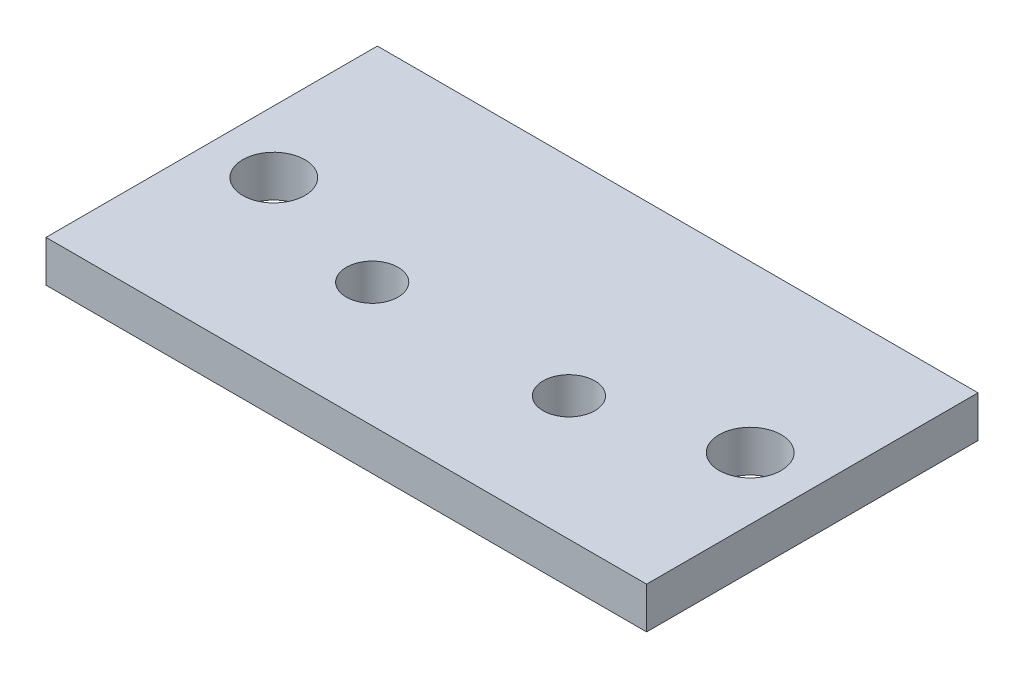
ISO-10303-21;
HEADER;
FILE_DESCRIPTION(('STEP AP214'),'2;1');
FILE_NAME('part.step','',(''),(''),'','','');
FILE_SCHEMA(('AUTOMOTIVE_DESIGN { 1 0 10303 214 1 1 1 1 }'));
ENDSEC;
DATA;
#1=APPLICATION_CONTEXT('core data for automotive mechanical design processes');
#2=APPLICATION_PROTOCOL_DEFINITION('international standard','automotive_design',2000,#1);
#3=PRODUCT_CONTEXT('',#1,'mechanical');
#4=PRODUCT('Part','Part','',(#3));
#5=PRODUCT_RELATED_PRODUCT_CATEGORY('part','',(#4));
#6=PRODUCT_DEFINITION_FORMATION('','',#4);
#7=PRODUCT_DEFINITION_CONTEXT('part definition',#1,'design');
#8=PRODUCT_DEFINITION('design','',#6,#7);
#9=PRODUCT_DEFINITION_SHAPE('','',#8);
#10=(LENGTH_UNIT() NAMED_UNIT(*) SI_UNIT(.MILLI.,.METRE.));
#11=(NAMED_UNIT(*) PLANE_ANGLE_UNIT() SI_UNIT($,.RADIAN.));
#12=(NAMED_UNIT(*) SI_UNIT($,.STERADIAN.) SOLID_ANGLE_UNIT());
#13=UNCERTAINTY_MEASURE_WITH_UNIT(LENGTH_MEASURE(1.E-05),#10,'distance_accuracy_value','');
#14=(GEOMETRIC_REPRESENTATION_CONTEXT(3) GLOBAL_UNCERTAINTY_ASSIGNED_CONTEXT((#13)) GLOBAL_UNIT_ASSIGNED_CONTEXT((#10,
#11,#12)) REPRESENTATION_CONTEXT('',''));
#15=CARTESIAN_POINT('',(0.,0.,0.));
#16=DIRECTION('',(0.,0.,1.));
#17=DIRECTION('',(1.,0.,0.));
#18=AXIS2_PLACEMENT_3D('',#15,#16,#17);
#19=CARTESIAN_POINT('',(0.,2.,0.));
#20=DIRECTION('',(0.,1.,0.));
#21=DIRECTION('',(0.,0.,1.));
#22=AXIS2_PLACEMENT_3D('',#19,#20,#21);
#23=PLANE('',#22);
#24=CARTESIAN_POINT('',(-4.75,2.,1.99999999999999));
#25=DIRECTION('',(0.,1.,0.));
#26=DIRECTION('',(0.,0.,1.));
#27=AXIS2_PLACEMENT_3D('',#24,#25,#26);
#28=CIRCLE('',#27,1.25);
#29=CARTESIAN_POINT('',(-4.75,2.,3.25));
#30=VERTEX_POINT('',#29);
#31=EDGE_CURVE('E127',#30,#30,#28,.T.);
#32=ORIENTED_EDGE('',*,*,#31,.F.);
#33=EDGE_LOOP('',(#32));
#34=FACE_BOUND('',#33,.T.);
#35=CARTESIAN_POINT('',(11.5,2.,0.));
#36=DIRECTION('',(0.,1.,0.));
#37=DIRECTION('',(0.,0.,1.));
#38=AXIS2_PLACEMENT_3D('',#35,#36,#37);
#39=CIRCLE('',#38,1.5);
#40=CARTESIAN_POINT('',(11.5,2.,1.5));
#41=VERTEX_POINT('',#40);
#42=EDGE_CURVE('E106',#41,#41,#39,.T.);
#43=ORIENTED_EDGE('',*,*,#42,.F.);
#44=EDGE_LOOP('',(#43));
#45=FACE_BOUND('',#44,.T.);
#46=DIRECTION('',(0.,0.,1.));
#47=VECTOR('',#46,1.);
#48=CARTESIAN_POINT('',(-14.5,2.,8.));
#49=LINE('',#48,#47);
#50=CARTESIAN_POINT('',(-14.5,2.,-8.));
#51=VERTEX_POINT('',#50);
#52=CARTESIAN_POINT('',(-14.5,2.,8.));
#53=VERTEX_POINT('',#52);
#54=EDGE_CURVE('E91',#51,#53,#49,.T.);
#55=ORIENTED_EDGE('',*,*,#54,.T.);
#56=DIRECTION('',(1.,0.,0.));
#57=VECTOR('',#56,1.);
#58=CARTESIAN_POINT('',(-14.5,2.,8.));
#59=LINE('',#58,#57);
#60=CARTESIAN_POINT('',(14.5,2.,8.));
#61=VERTEX_POINT('',#60);
#62=EDGE_CURVE('E86',#53,#61,#59,.T.);
#63=ORIENTED_EDGE('',*,*,#62,.T.);
#64=DIRECTION('',(0.,0.,-1.));
#65=VECTOR('',#64,1.);
#66=CARTESIAN_POINT('',(14.5,2.,8.));
#67=LINE('',#66,#65);
#68=CARTESIAN_POINT('',(14.5,2.,-8.));
#69=VERTEX_POINT('',#68);
#70=EDGE_CURVE('E89',#61,#69,#67,.T.);
#71=ORIENTED_EDGE('',*,*,#70,.T.);
#72=DIRECTION('',(-1.,0.,0.));
#73=VECTOR('',#72,1.);
#74=CARTESIAN_POINT('',(14.5,2.,-8.));
#75=LINE('',#74,#73);
#76=EDGE_CURVE('E56',#69,#51,#75,.T.);
#77=ORIENTED_EDGE('',*,*,#76,.T.);
#78=EDGE_LOOP('',(#55,#63,#71,#77));
#79=FACE_BOUND('',#78,.T.);
#80=CARTESIAN_POINT('',(-11.5,2.,0.));
#81=DIRECTION('',(0.,1.,0.));
#82=DIRECTION('',(0.,0.,-1.));
#83=AXIS2_PLACEMENT_3D('',#80,#81,#82);
#84=CIRCLE('',#83,1.5);
#85=CARTESIAN_POINT('',(-11.5,2.,-1.5));
#86=VERTEX_POINT('',#85);
#87=EDGE_CURVE('E121',#86,#86,#84,.T.);
#88=ORIENTED_EDGE('',*,*,#87,.F.);
#89=EDGE_LOOP('',(#88));
#90=FACE_BOUND('',#89,.T.);
#91=CARTESIAN_POINT('',(4.75000000000001,2.,1.99999999999999));
#92=DIRECTION('',(0.,1.,0.));
#93=DIRECTION('',(0.,0.,-1.));
#94=AXIS2_PLACEMENT_3D('',#91,#92,#93);
#95=CIRCLE('',#94,1.25);
#96=CARTESIAN_POINT('',(4.75000000000001,2.,0.749999999999993));
#97=VERTEX_POINT('',#96);
#98=EDGE_CURVE('E133',#97,#97,#95,.T.);
#99=ORIENTED_EDGE('',*,*,#98,.F.);
#100=EDGE_LOOP('',(#99));
#101=FACE_BOUND('',#100,.T.);
#102=ADVANCED_FACE('F39',(#34,#45,#79,#90,#101),#23,.T.);
#103=CARTESIAN_POINT('',(0.,0.,0.));
#104=DIRECTION('',(0.,1.,0.));
#105=DIRECTION('',(0.,0.,1.));
#106=AXIS2_PLACEMENT_3D('',#103,#104,#105);
#107=PLANE('',#106);
#108=DIRECTION('',(0.,0.,1.));
#109=VECTOR('',#108,1.);
#110=CARTESIAN_POINT('',(-14.5,0.,8.));
#111=LINE('',#110,#109);
#112=CARTESIAN_POINT('',(-14.5,0.,-8.));
#113=VERTEX_POINT('',#112);
#114=CARTESIAN_POINT('',(-14.5,0.,8.));
#115=VERTEX_POINT('',#114);
#116=EDGE_CURVE('E103',#113,#115,#111,.T.);
#117=ORIENTED_EDGE('',*,*,#116,.F.);
#118=DIRECTION('',(-1.,0.,0.));
#119=VECTOR('',#118,1.);
#120=CARTESIAN_POINT('',(14.5,0.,-8.));
#121=LINE('',#120,#119);
#122=CARTESIAN_POINT('',(14.5,0.,-8.));
#123=VERTEX_POINT('',#122);
#124=EDGE_CURVE('E79',#123,#113,#121,.T.);
#125=ORIENTED_EDGE('',*,*,#124,.F.);
#126=DIRECTION('',(0.,0.,-1.));
#127=VECTOR('',#126,1.);
#128=CARTESIAN_POINT('',(14.5,0.,8.));
#129=LINE('',#128,#127);
#130=CARTESIAN_POINT('',(14.5,0.,8.));
#131=VERTEX_POINT('',#130);
#132=EDGE_CURVE('E73',#131,#123,#129,.T.);
#133=ORIENTED_EDGE('',*,*,#132,.F.);
#134=DIRECTION('',(1.,0.,0.));
#135=VECTOR('',#134,1.);
#136=CARTESIAN_POINT('',(-14.5,0.,8.));
#137=LINE('',#136,#135);
#138=EDGE_CURVE('E95',#115,#131,#137,.T.);
#139=ORIENTED_EDGE('',*,*,#138,.F.);
#140=EDGE_LOOP('',(#117,#125,#133,#139));
#141=FACE_BOUND('',#140,.T.);
#142=CARTESIAN_POINT('',(11.5,0.,0.));
#143=DIRECTION('',(0.,1.,0.));
#144=DIRECTION('',(0.,0.,1.));
#145=AXIS2_PLACEMENT_3D('',#142,#143,#144);
#146=CIRCLE('',#145,1.5);
#147=CARTESIAN_POINT('',(11.5,0.,1.5));
#148=VERTEX_POINT('',#147);
#149=EDGE_CURVE('E118',#148,#148,#146,.T.);
#150=ORIENTED_EDGE('',*,*,#149,.T.);
#151=EDGE_LOOP('',(#150));
#152=FACE_BOUND('',#151,.T.);
#153=CARTESIAN_POINT('',(-11.5,0.,0.));
#154=DIRECTION('',(0.,1.,0.));
#155=DIRECTION('',(0.,0.,-1.));
#156=AXIS2_PLACEMENT_3D('',#153,#154,#155);
#157=CIRCLE('',#156,1.5);
#158=CARTESIAN_POINT('',(-11.5,0.,-1.5));
#159=VERTEX_POINT('',#158);
#160=EDGE_CURVE('E124',#159,#159,#157,.T.);
#161=ORIENTED_EDGE('',*,*,#160,.T.);
#162=EDGE_LOOP('',(#161));
#163=FACE_BOUND('',#162,.T.);
#164=CARTESIAN_POINT('',(-4.75,0.,1.99999999999999));
#165=DIRECTION('',(0.,1.,0.));
#166=DIRECTION('',(0.,0.,1.));
#167=AXIS2_PLACEMENT_3D('',#164,#165,#166);
#168=CIRCLE('',#167,1.25);
#169=CARTESIAN_POINT('',(-4.75,0.,3.25));
#170=VERTEX_POINT('',#169);
#171=EDGE_CURVE('E130',#170,#170,#168,.T.);
#172=ORIENTED_EDGE('',*,*,#171,.T.);
#173=EDGE_LOOP('',(#172));
#174=FACE_BOUND('',#173,.T.);
#175=CARTESIAN_POINT('',(4.75000000000001,0.,1.99999999999999));
#176=DIRECTION('',(0.,1.,0.));
#177=DIRECTION('',(0.,0.,-1.));
#178=AXIS2_PLACEMENT_3D('',#175,#176,#177);
#179=CIRCLE('',#178,1.25);
#180=CARTESIAN_POINT('',(4.75000000000001,0.,0.749999999999993));
#181=VERTEX_POINT('',#180);
#182=EDGE_CURVE('E136',#181,#181,#179,.T.);
#183=ORIENTED_EDGE('',*,*,#182,.T.);
#184=EDGE_LOOP('',(#183));
#185=FACE_BOUND('',#184,.T.);
#186=ADVANCED_FACE('F114',(#141,#152,#163,#174,#185),#107,.F.);
#187=CARTESIAN_POINT('',(-14.5,2.,8.));
#188=DIRECTION('',(1.,0.,0.));
#189=DIRECTION('',(0.,0.,-1.));
#190=AXIS2_PLACEMENT_3D('',#187,#188,#189);
#191=PLANE('',#190);
#192=ORIENTED_EDGE('',*,*,#116,.T.);
#193=DIRECTION('',(0.,-1.,0.));
#194=VECTOR('',#193,1.);
#195=CARTESIAN_POINT('',(-14.5,2.,8.));
#196=LINE('',#195,#194);
#197=EDGE_CURVE('E11',#53,#115,#196,.T.);
#198=ORIENTED_EDGE('',*,*,#197,.F.);
#199=ORIENTED_EDGE('',*,*,#54,.F.);
#200=DIRECTION('',(0.,-1.,0.));
#201=VECTOR('',#200,1.);
#202=CARTESIAN_POINT('',(-14.5,2.,-8.));
#203=LINE('',#202,#201);
#204=EDGE_CURVE('E99',#51,#113,#203,.T.);
#205=ORIENTED_EDGE('',*,*,#204,.T.);
#206=EDGE_LOOP('',(#192,#198,#199,#205));
#207=FACE_BOUND('',#206,.T.);
#208=ADVANCED_FACE('F41',(#207),#191,.F.);
#209=CARTESIAN_POINT('',(-14.5,2.,8.));
#210=DIRECTION('',(0.,0.,-1.));
#211=DIRECTION('',(-1.,0.,0.));
#212=AXIS2_PLACEMENT_3D('',#209,#210,#211);
#213=PLANE('',#212);
#214=ORIENTED_EDGE('',*,*,#138,.T.);
#215=DIRECTION('',(0.,-1.,0.));
#216=VECTOR('',#215,1.);
#217=CARTESIAN_POINT('',(14.5,2.,8.));
#218=LINE('',#217,#216);
#219=EDGE_CURVE('E48',#61,#131,#218,.T.);
#220=ORIENTED_EDGE('',*,*,#219,.F.);
#221=ORIENTED_EDGE('',*,*,#62,.F.);
#222=ORIENTED_EDGE('',*,*,#197,.T.);
#223=EDGE_LOOP('',(#214,#220,#221,#222));
#224=FACE_BOUND('',#223,.T.);
#225=ADVANCED_FACE('F94',(#224),#213,.F.);
#226=CARTESIAN_POINT('',(14.5,2.,8.));
#227=DIRECTION('',(-1.,0.,0.));
#228=DIRECTION('',(0.,0.,1.));
#229=AXIS2_PLACEMENT_3D('',#226,#227,#228);
#230=PLANE('',#229);
#231=ORIENTED_EDGE('',*,*,#132,.T.);
#232=DIRECTION('',(0.,-1.,0.));
#233=VECTOR('',#232,1.);
#234=CARTESIAN_POINT('',(14.5,2.,-8.));
#235=LINE('',#234,#233);
#236=EDGE_CURVE('E96',#69,#123,#235,.T.);
#237=ORIENTED_EDGE('',*,*,#236,.F.);
#238=ORIENTED_EDGE('',*,*,#70,.F.);
#239=ORIENTED_EDGE('',*,*,#219,.T.);
#240=EDGE_LOOP('',(#231,#237,#238,#239));
#241=FACE_BOUND('',#240,.T.);
#242=ADVANCED_FACE('F97',(#241),#230,.F.);
#243=CARTESIAN_POINT('',(14.5,2.,-8.));
#244=DIRECTION('',(0.,0.,1.));
#245=DIRECTION('',(1.,0.,0.));
#246=AXIS2_PLACEMENT_3D('',#243,#244,#245);
#247=PLANE('',#246);
#248=ORIENTED_EDGE('',*,*,#124,.T.);
#249=ORIENTED_EDGE('',*,*,#204,.F.);
#250=ORIENTED_EDGE('',*,*,#76,.F.);
#251=ORIENTED_EDGE('',*,*,#236,.T.);
#252=EDGE_LOOP('',(#248,#249,#250,#251));
#253=FACE_BOUND('',#252,.T.);
#254=ADVANCED_FACE('F111',(#253),#247,.F.);
#255=CARTESIAN_POINT('',(11.5,2.,0.));
#256=DIRECTION('',(0.,-1.,0.));
#257=DIRECTION('',(0.,0.,-1.));
#258=AXIS2_PLACEMENT_3D('',#255,#256,#257);
#259=CYLINDRICAL_SURFACE('',#258,1.5);
#260=ORIENTED_EDGE('',*,*,#42,.T.);
#261=EDGE_LOOP('',(#260));
#262=FACE_BOUND('',#261,.T.);
#263=ORIENTED_EDGE('',*,*,#149,.F.);
#264=EDGE_LOOP('',(#263));
#265=FACE_BOUND('',#264,.T.);
#266=ADVANCED_FACE('F155',(#262,#265),#259,.F.);
#267=CARTESIAN_POINT('',(-11.5,2.,0.));
#268=DIRECTION('',(0.,-1.,0.));
#269=DIRECTION('',(0.,0.,-1.));
#270=AXIS2_PLACEMENT_3D('',#267,#268,#269);
#271=CYLINDRICAL_SURFACE('',#270,1.5);
#272=ORIENTED_EDGE('',*,*,#87,.T.);
#273=EDGE_LOOP('',(#272));
#274=FACE_BOUND('',#273,.T.);
#275=ORIENTED_EDGE('',*,*,#160,.F.);
#276=EDGE_LOOP('',(#275));
#277=FACE_BOUND('',#276,.T.);
#278=ADVANCED_FACE('F200',(#274,#277),#271,.F.);
#279=CARTESIAN_POINT('',(-4.75,2.,1.99999999999999));
#280=DIRECTION('',(0.,-1.,0.));
#281=DIRECTION('',(0.,0.,-1.));
#282=AXIS2_PLACEMENT_3D('',#279,#280,#281);
#283=CYLINDRICAL_SURFACE('',#282,1.25);
#284=ORIENTED_EDGE('',*,*,#31,.T.);
#285=EDGE_LOOP('',(#284));
#286=FACE_BOUND('',#285,.T.);
#287=ORIENTED_EDGE('',*,*,#171,.F.);
#288=EDGE_LOOP('',(#287));
#289=FACE_BOUND('',#288,.T.);
#290=ADVANCED_FACE('F208',(#286,#289),#283,.F.);
#291=CARTESIAN_POINT('',(4.75000000000001,2.,1.99999999999999));
#292=DIRECTION('',(0.,-1.,0.));
#293=DIRECTION('',(0.,0.,-1.));
#294=AXIS2_PLACEMENT_3D('',#291,#292,#293);
#295=CYLINDRICAL_SURFACE('',#294,1.25);
#296=ORIENTED_EDGE('',*,*,#98,.T.);
#297=EDGE_LOOP('',(#296));
#298=FACE_BOUND('',#297,.T.);
#299=ORIENTED_EDGE('',*,*,#182,.F.);
#300=EDGE_LOOP('',(#299));
#301=FACE_BOUND('',#300,.T.);
#302=ADVANCED_FACE('F142',(#298,#301),#295,.F.);
#303=CLOSED_SHELL('',(#102,#186,#208,#225,#242,#254,#266,#278,#290,#302));
#304=MANIFOLD_SOLID_BREP('B2',#303);
#305=ADVANCED_BREP_SHAPE_REPRESENTATION('',(#18,#304),#14);
#306=SHAPE_DEFINITION_REPRESENTATION(#9,#305);
ENDSEC;
END-ISO-10303-21;
